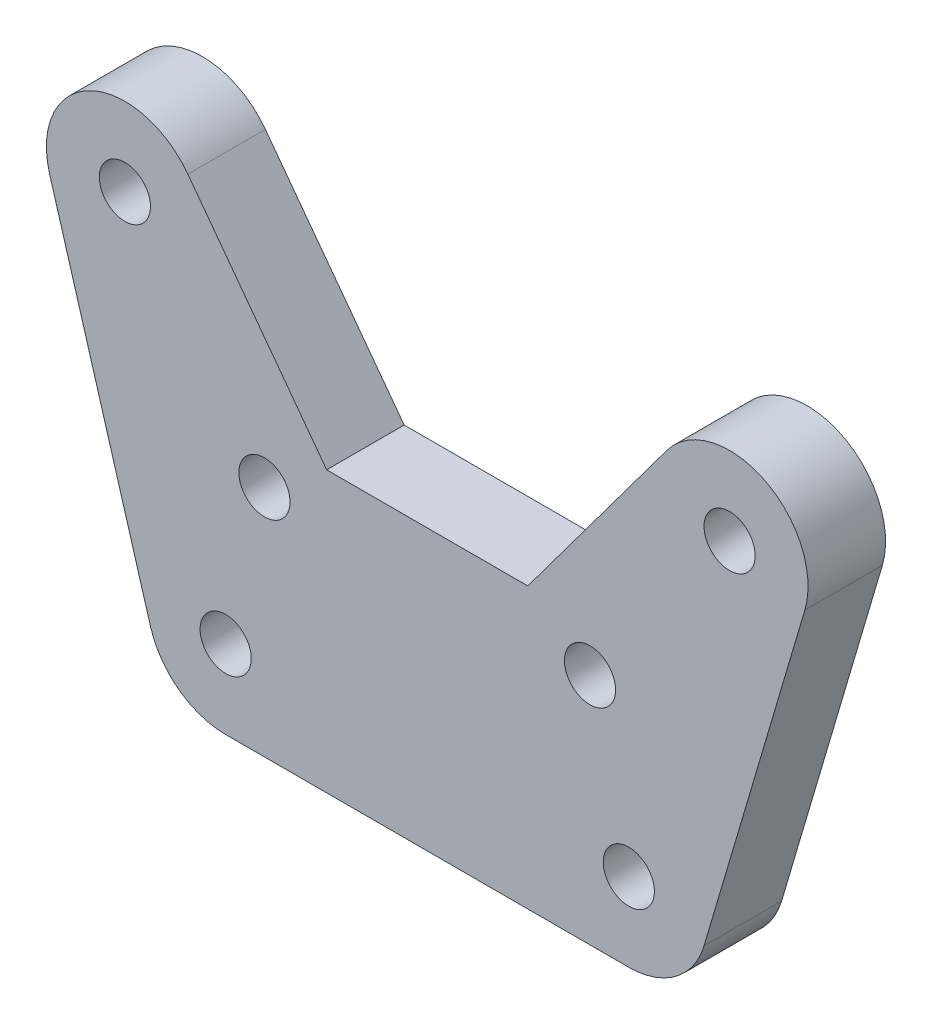
ISO-10303-21;
HEADER;
FILE_DESCRIPTION(('STEP AP214'),'2;1');
FILE_NAME('part.step','',(''),(''),'','','');
FILE_SCHEMA(('AUTOMOTIVE_DESIGN { 1 0 10303 214 1 1 1 1 }'));
ENDSEC;
DATA;
#1=APPLICATION_CONTEXT('core data for automotive mechanical design processes');
#2=APPLICATION_PROTOCOL_DEFINITION('international standard','automotive_design',2000,#1);
#3=PRODUCT_CONTEXT('',#1,'mechanical');
#4=PRODUCT('Part','Part','',(#3));
#5=PRODUCT_RELATED_PRODUCT_CATEGORY('part','',(#4));
#6=PRODUCT_DEFINITION_FORMATION('','',#4);
#7=PRODUCT_DEFINITION_CONTEXT('part definition',#1,'design');
#8=PRODUCT_DEFINITION('design','',#6,#7);
#9=PRODUCT_DEFINITION_SHAPE('','',#8);
#10=(LENGTH_UNIT() NAMED_UNIT(*) SI_UNIT(.MILLI.,.METRE.));
#11=(NAMED_UNIT(*) PLANE_ANGLE_UNIT() SI_UNIT($,.RADIAN.));
#12=(NAMED_UNIT(*) SI_UNIT($,.STERADIAN.) SOLID_ANGLE_UNIT());
#13=UNCERTAINTY_MEASURE_WITH_UNIT(LENGTH_MEASURE(1.E-05),#10,'distance_accuracy_value','');
#14=(GEOMETRIC_REPRESENTATION_CONTEXT(3) GLOBAL_UNCERTAINTY_ASSIGNED_CONTEXT((#13)) GLOBAL_UNIT_ASSIGNED_CONTEXT((#10,
#11,#12)) REPRESENTATION_CONTEXT('',''));
#15=CARTESIAN_POINT('',(0.,0.,0.));
#16=DIRECTION('',(0.,0.,1.));
#17=DIRECTION('',(1.,0.,0.));
#18=AXIS2_PLACEMENT_3D('',#15,#16,#17);
#19=CARTESIAN_POINT('',(13.,-10.,5.));
#20=DIRECTION('',(0.,0.,1.));
#21=DIRECTION('',(1.,0.,0.));
#22=AXIS2_PLACEMENT_3D('',#19,#20,#21);
#23=PLANE('',#22);
#24=CARTESIAN_POINT('',(-19.5,12.,5.));
#25=DIRECTION('',(0.,0.,1.));
#26=DIRECTION('',(-1.,0.,0.));
#27=AXIS2_PLACEMENT_3D('',#24,#25,#26);
#28=CIRCLE('',#27,1.65);
#29=CARTESIAN_POINT('',(-21.15,12.,5.));
#30=VERTEX_POINT('',#29);
#31=EDGE_CURVE('E240',#30,#30,#28,.T.);
#32=ORIENTED_EDGE('',*,*,#31,.F.);
#33=EDGE_LOOP('',(#32));
#34=FACE_BOUND('',#33,.T.);
#35=CARTESIAN_POINT('',(13.,-10.,5.));
#36=DIRECTION('',(0.,0.,1.));
#37=DIRECTION('',(1.,0.,0.));
#38=AXIS2_PLACEMENT_3D('',#35,#36,#37);
#39=CIRCLE('',#38,1.65);
#40=CARTESIAN_POINT('',(14.65,-10.,5.));
#41=VERTEX_POINT('',#40);
#42=EDGE_CURVE('E228',#41,#41,#39,.T.);
#43=ORIENTED_EDGE('',*,*,#42,.F.);
#44=EDGE_LOOP('',(#43));
#45=FACE_BOUND('',#44,.T.);
#46=CARTESIAN_POINT('',(10.5,0.,5.));
#47=DIRECTION('',(0.,0.,1.));
#48=DIRECTION('',(1.,0.,0.));
#49=AXIS2_PLACEMENT_3D('',#46,#47,#48);
#50=CIRCLE('',#49,1.65);
#51=CARTESIAN_POINT('',(12.15,0.,5.));
#52=VERTEX_POINT('',#51);
#53=EDGE_CURVE('E156',#52,#52,#50,.T.);
#54=ORIENTED_EDGE('',*,*,#53,.F.);
#55=EDGE_LOOP('',(#54));
#56=FACE_BOUND('',#55,.T.);
#57=CARTESIAN_POINT('',(13.,-10.,5.));
#58=DIRECTION('',(0.,0.,1.));
#59=DIRECTION('',(1.,0.,0.));
#60=AXIS2_PLACEMENT_3D('',#57,#58,#59);
#61=CIRCLE('',#60,5.06113986733945);
#62=CARTESIAN_POINT('',(13.,-15.0611398673394,5.));
#63=VERTEX_POINT('',#62);
#64=CARTESIAN_POINT('',(17.8537227557414,-11.43405445056,5.));
#65=VERTEX_POINT('',#64);
#66=EDGE_CURVE('E171',#63,#65,#61,.T.);
#67=ORIENTED_EDGE('',*,*,#66,.T.);
#68=DIRECTION('',(0.283346141017402,0.9590177080589,0.));
#69=VECTOR('',#68,1.);
#70=CARTESIAN_POINT('',(17.8537227557414,-11.43405445056,5.));
#71=LINE('',#70,#69);
#72=CARTESIAN_POINT('',(24.3537227557414,10.56594554944,5.));
#73=VERTEX_POINT('',#72);
#74=EDGE_CURVE('E109',#65,#73,#71,.T.);
#75=ORIENTED_EDGE('',*,*,#74,.T.);
#76=CARTESIAN_POINT('',(19.5,12.,5.));
#77=DIRECTION('',(0.,0.,1.));
#78=DIRECTION('',(1.,0.,0.));
#79=AXIS2_PLACEMENT_3D('',#76,#77,#78);
#80=CIRCLE('',#79,5.06113986733945);
#81=CARTESIAN_POINT('',(15.4387442431768,15.0201553659445,5.));
#82=VERTEX_POINT('',#81);
#83=EDGE_CURVE('E192',#73,#82,#80,.T.);
#84=ORIENTED_EDGE('',*,*,#83,.T.);
#85=DIRECTION('',(-0.596734222943357,-0.802438949184415,0.));
#86=VECTOR('',#85,1.);
#87=CARTESIAN_POINT('',(15.4387442431768,15.0201553659445,5.));
#88=LINE('',#87,#86);
#89=CARTESIAN_POINT('',(6.48780525407793,2.98367111471678,5.));
#90=VERTEX_POINT('',#89);
#91=EDGE_CURVE('E211',#82,#90,#88,.T.);
#92=ORIENTED_EDGE('',*,*,#91,.T.);
#93=DIRECTION('',(-1.,0.,0.));
#94=VECTOR('',#93,1.);
#95=CARTESIAN_POINT('',(6.48780525407793,2.98367111471678,5.));
#96=LINE('',#95,#94);
#97=CARTESIAN_POINT('',(-6.48780525407793,2.98367111471678,5.));
#98=VERTEX_POINT('',#97);
#99=EDGE_CURVE('E208',#90,#98,#96,.T.);
#100=ORIENTED_EDGE('',*,*,#99,.T.);
#101=DIRECTION('',(-0.596734222943357,0.802438949184415,0.));
#102=VECTOR('',#101,1.);
#103=CARTESIAN_POINT('',(-15.4387442431768,15.0201553659445,5.));
#104=LINE('',#103,#102);
#105=CARTESIAN_POINT('',(-15.4387442431768,15.0201553659445,5.));
#106=VERTEX_POINT('',#105);
#107=EDGE_CURVE('E210',#98,#106,#104,.T.);
#108=ORIENTED_EDGE('',*,*,#107,.T.);
#109=CARTESIAN_POINT('',(-19.5,12.,5.));
#110=DIRECTION('',(0.,0.,1.));
#111=DIRECTION('',(-1.,0.,0.));
#112=AXIS2_PLACEMENT_3D('',#109,#110,#111);
#113=CIRCLE('',#112,5.06113986733945);
#114=CARTESIAN_POINT('',(-24.3537227557414,10.56594554944,5.));
#115=VERTEX_POINT('',#114);
#116=EDGE_CURVE('E134',#106,#115,#113,.T.);
#117=ORIENTED_EDGE('',*,*,#116,.T.);
#118=DIRECTION('',(0.283346141017402,-0.9590177080589,0.));
#119=VECTOR('',#118,1.);
#120=CARTESIAN_POINT('',(-17.8537227557414,-11.43405445056,5.));
#121=LINE('',#120,#119);
#122=CARTESIAN_POINT('',(-17.8537227557414,-11.43405445056,5.));
#123=VERTEX_POINT('',#122);
#124=EDGE_CURVE('E128',#115,#123,#121,.T.);
#125=ORIENTED_EDGE('',*,*,#124,.T.);
#126=CARTESIAN_POINT('',(-13.,-10.,5.));
#127=DIRECTION('',(0.,0.,1.));
#128=DIRECTION('',(-1.,0.,0.));
#129=AXIS2_PLACEMENT_3D('',#126,#127,#128);
#130=CIRCLE('',#129,5.06113986733945);
#131=CARTESIAN_POINT('',(-13.,-15.0611398673394,5.));
#132=VERTEX_POINT('',#131);
#133=EDGE_CURVE('E132',#123,#132,#130,.T.);
#134=ORIENTED_EDGE('',*,*,#133,.T.);
#135=DIRECTION('',(1.,0.,0.));
#136=VECTOR('',#135,1.);
#137=CARTESIAN_POINT('',(13.,-15.0611398673394,5.));
#138=LINE('',#137,#136);
#139=EDGE_CURVE('E60',#132,#63,#138,.T.);
#140=ORIENTED_EDGE('',*,*,#139,.T.);
#141=EDGE_LOOP('',(#67,#75,#84,#92,#100,#108,#117,#125,#134,#140));
#142=FACE_BOUND('',#141,.T.);
#143=CARTESIAN_POINT('',(19.5,12.,5.));
#144=DIRECTION('',(0.,0.,1.));
#145=DIRECTION('',(1.,0.,0.));
#146=AXIS2_PLACEMENT_3D('',#143,#144,#145);
#147=CIRCLE('',#146,1.65);
#148=CARTESIAN_POINT('',(21.15,12.,5.));
#149=VERTEX_POINT('',#148);
#150=EDGE_CURVE('E222',#149,#149,#147,.T.);
#151=ORIENTED_EDGE('',*,*,#150,.F.);
#152=EDGE_LOOP('',(#151));
#153=FACE_BOUND('',#152,.T.);
#154=CARTESIAN_POINT('',(-13.,-10.,5.));
#155=DIRECTION('',(0.,0.,1.));
#156=DIRECTION('',(-1.,0.,0.));
#157=AXIS2_PLACEMENT_3D('',#154,#155,#156);
#158=CIRCLE('',#157,1.65);
#159=CARTESIAN_POINT('',(-14.65,-10.,5.));
#160=VERTEX_POINT('',#159);
#161=EDGE_CURVE('E234',#160,#160,#158,.T.);
#162=ORIENTED_EDGE('',*,*,#161,.F.);
#163=EDGE_LOOP('',(#162));
#164=FACE_BOUND('',#163,.T.);
#165=CARTESIAN_POINT('',(-10.5,0.,5.));
#166=DIRECTION('',(0.,0.,1.));
#167=DIRECTION('',(-1.,0.,0.));
#168=AXIS2_PLACEMENT_3D('',#165,#166,#167);
#169=CIRCLE('',#168,1.65);
#170=CARTESIAN_POINT('',(-12.15,0.,5.));
#171=VERTEX_POINT('',#170);
#172=EDGE_CURVE('E246',#171,#171,#169,.T.);
#173=ORIENTED_EDGE('',*,*,#172,.F.);
#174=EDGE_LOOP('',(#173));
#175=FACE_BOUND('',#174,.T.);
#176=ADVANCED_FACE('F43',(#34,#45,#56,#142,#153,#164,#175),#23,.T.);
#177=CARTESIAN_POINT('',(13.,-10.,0.));
#178=DIRECTION('',(0.,0.,1.));
#179=DIRECTION('',(1.,0.,0.));
#180=AXIS2_PLACEMENT_3D('',#177,#178,#179);
#181=PLANE('',#180);
#182=CARTESIAN_POINT('',(13.,-10.,0.));
#183=DIRECTION('',(0.,0.,1.));
#184=DIRECTION('',(1.,0.,0.));
#185=AXIS2_PLACEMENT_3D('',#182,#183,#184);
#186=CIRCLE('',#185,5.06113986733945);
#187=CARTESIAN_POINT('',(13.,-15.0611398673394,0.));
#188=VERTEX_POINT('',#187);
#189=CARTESIAN_POINT('',(17.8537227557414,-11.43405445056,0.));
#190=VERTEX_POINT('',#189);
#191=EDGE_CURVE('E152',#188,#190,#186,.T.);
#192=ORIENTED_EDGE('',*,*,#191,.F.);
#193=DIRECTION('',(1.,0.,0.));
#194=VECTOR('',#193,1.);
#195=CARTESIAN_POINT('',(13.,-15.0611398673394,0.));
#196=LINE('',#195,#194);
#197=CARTESIAN_POINT('',(-13.,-15.0611398673394,0.));
#198=VERTEX_POINT('',#197);
#199=EDGE_CURVE('E101',#198,#188,#196,.T.);
#200=ORIENTED_EDGE('',*,*,#199,.F.);
#201=CARTESIAN_POINT('',(-13.,-10.,0.));
#202=DIRECTION('',(0.,0.,1.));
#203=DIRECTION('',(-1.,0.,0.));
#204=AXIS2_PLACEMENT_3D('',#201,#202,#203);
#205=CIRCLE('',#204,5.06113986733945);
#206=CARTESIAN_POINT('',(-17.8537227557414,-11.43405445056,0.));
#207=VERTEX_POINT('',#206);
#208=EDGE_CURVE('E95',#207,#198,#205,.T.);
#209=ORIENTED_EDGE('',*,*,#208,.F.);
#210=DIRECTION('',(0.283346141017402,-0.9590177080589,0.));
#211=VECTOR('',#210,1.);
#212=CARTESIAN_POINT('',(-17.8537227557414,-11.43405445056,0.));
#213=LINE('',#212,#211);
#214=CARTESIAN_POINT('',(-24.3537227557414,10.56594554944,0.));
#215=VERTEX_POINT('',#214);
#216=EDGE_CURVE('E142',#215,#207,#213,.T.);
#217=ORIENTED_EDGE('',*,*,#216,.F.);
#218=CARTESIAN_POINT('',(-19.5,12.,0.));
#219=DIRECTION('',(0.,0.,1.));
#220=DIRECTION('',(-1.,0.,0.));
#221=AXIS2_PLACEMENT_3D('',#218,#219,#220);
#222=CIRCLE('',#221,5.06113986733945);
#223=CARTESIAN_POINT('',(-15.4387442431768,15.0201553659445,0.));
#224=VERTEX_POINT('',#223);
#225=EDGE_CURVE('E166',#224,#215,#222,.T.);
#226=ORIENTED_EDGE('',*,*,#225,.F.);
#227=DIRECTION('',(-0.596734222943357,0.802438949184415,0.));
#228=VECTOR('',#227,1.);
#229=CARTESIAN_POINT('',(-15.4387442431768,15.0201553659445,0.));
#230=LINE('',#229,#228);
#231=CARTESIAN_POINT('',(-6.48780525407793,2.98367111471678,0.));
#232=VERTEX_POINT('',#231);
#233=EDGE_CURVE('E164',#232,#224,#230,.T.);
#234=ORIENTED_EDGE('',*,*,#233,.F.);
#235=DIRECTION('',(-1.,0.,0.));
#236=VECTOR('',#235,1.);
#237=CARTESIAN_POINT('',(6.48780525407793,2.98367111471678,0.));
#238=LINE('',#237,#236);
#239=CARTESIAN_POINT('',(6.48780525407793,2.98367111471678,0.));
#240=VERTEX_POINT('',#239);
#241=EDGE_CURVE('E162',#240,#232,#238,.T.);
#242=ORIENTED_EDGE('',*,*,#241,.F.);
#243=DIRECTION('',(-0.596734222943357,-0.802438949184415,0.));
#244=VECTOR('',#243,1.);
#245=CARTESIAN_POINT('',(15.4387442431768,15.0201553659445,0.));
#246=LINE('',#245,#244);
#247=CARTESIAN_POINT('',(15.4387442431768,15.0201553659445,0.));
#248=VERTEX_POINT('',#247);
#249=EDGE_CURVE('E160',#248,#240,#246,.T.);
#250=ORIENTED_EDGE('',*,*,#249,.F.);
#251=CARTESIAN_POINT('',(19.5,12.,0.));
#252=DIRECTION('',(0.,0.,1.));
#253=DIRECTION('',(1.,0.,0.));
#254=AXIS2_PLACEMENT_3D('',#251,#252,#253);
#255=CIRCLE('',#254,5.06113986733945);
#256=CARTESIAN_POINT('',(24.3537227557414,10.56594554944,0.));
#257=VERTEX_POINT('',#256);
#258=EDGE_CURVE('E158',#257,#248,#255,.T.);
#259=ORIENTED_EDGE('',*,*,#258,.F.);
#260=DIRECTION('',(0.283346141017402,0.9590177080589,0.));
#261=VECTOR('',#260,1.);
#262=CARTESIAN_POINT('',(17.8537227557414,-11.43405445056,0.));
#263=LINE('',#262,#261);
#264=EDGE_CURVE('E155',#190,#257,#263,.T.);
#265=ORIENTED_EDGE('',*,*,#264,.F.);
#266=EDGE_LOOP('',(#192,#200,#209,#217,#226,#234,#242,#250,#259,#265));
#267=FACE_BOUND('',#266,.T.);
#268=CARTESIAN_POINT('',(10.5,0.,0.));
#269=DIRECTION('',(0.,0.,1.));
#270=DIRECTION('',(1.,0.,0.));
#271=AXIS2_PLACEMENT_3D('',#268,#269,#270);
#272=CIRCLE('',#271,1.65);
#273=CARTESIAN_POINT('',(12.15,0.,0.));
#274=VERTEX_POINT('',#273);
#275=EDGE_CURVE('E219',#274,#274,#272,.T.);
#276=ORIENTED_EDGE('',*,*,#275,.T.);
#277=EDGE_LOOP('',(#276));
#278=FACE_BOUND('',#277,.T.);
#279=CARTESIAN_POINT('',(19.5,12.,0.));
#280=DIRECTION('',(0.,0.,1.));
#281=DIRECTION('',(1.,0.,0.));
#282=AXIS2_PLACEMENT_3D('',#279,#280,#281);
#283=CIRCLE('',#282,1.65);
#284=CARTESIAN_POINT('',(21.15,12.,0.));
#285=VERTEX_POINT('',#284);
#286=EDGE_CURVE('E225',#285,#285,#283,.T.);
#287=ORIENTED_EDGE('',*,*,#286,.T.);
#288=EDGE_LOOP('',(#287));
#289=FACE_BOUND('',#288,.T.);
#290=CARTESIAN_POINT('',(13.,-10.,0.));
#291=DIRECTION('',(0.,0.,1.));
#292=DIRECTION('',(1.,0.,0.));
#293=AXIS2_PLACEMENT_3D('',#290,#291,#292);
#294=CIRCLE('',#293,1.65);
#295=CARTESIAN_POINT('',(14.65,-10.,0.));
#296=VERTEX_POINT('',#295);
#297=EDGE_CURVE('E231',#296,#296,#294,.T.);
#298=ORIENTED_EDGE('',*,*,#297,.T.);
#299=EDGE_LOOP('',(#298));
#300=FACE_BOUND('',#299,.T.);
#301=CARTESIAN_POINT('',(-13.,-10.,0.));
#302=DIRECTION('',(0.,0.,1.));
#303=DIRECTION('',(-1.,0.,0.));
#304=AXIS2_PLACEMENT_3D('',#301,#302,#303);
#305=CIRCLE('',#304,1.65);
#306=CARTESIAN_POINT('',(-14.65,-10.,0.));
#307=VERTEX_POINT('',#306);
#308=EDGE_CURVE('E237',#307,#307,#305,.T.);
#309=ORIENTED_EDGE('',*,*,#308,.T.);
#310=EDGE_LOOP('',(#309));
#311=FACE_BOUND('',#310,.T.);
#312=CARTESIAN_POINT('',(-19.5,12.,0.));
#313=DIRECTION('',(0.,0.,1.));
#314=DIRECTION('',(-1.,0.,0.));
#315=AXIS2_PLACEMENT_3D('',#312,#313,#314);
#316=CIRCLE('',#315,1.65);
#317=CARTESIAN_POINT('',(-21.15,12.,0.));
#318=VERTEX_POINT('',#317);
#319=EDGE_CURVE('E243',#318,#318,#316,.T.);
#320=ORIENTED_EDGE('',*,*,#319,.T.);
#321=EDGE_LOOP('',(#320));
#322=FACE_BOUND('',#321,.T.);
#323=CARTESIAN_POINT('',(-10.5,0.,0.));
#324=DIRECTION('',(0.,0.,1.));
#325=DIRECTION('',(-1.,0.,0.));
#326=AXIS2_PLACEMENT_3D('',#323,#324,#325);
#327=CIRCLE('',#326,1.65);
#328=CARTESIAN_POINT('',(-12.15,0.,0.));
#329=VERTEX_POINT('',#328);
#330=EDGE_CURVE('E249',#329,#329,#327,.T.);
#331=ORIENTED_EDGE('',*,*,#330,.T.);
#332=EDGE_LOOP('',(#331));
#333=FACE_BOUND('',#332,.T.);
#334=ADVANCED_FACE('F196',(#267,#278,#289,#300,#311,#322,#333),#181,.F.);
#335=CARTESIAN_POINT('',(13.,-10.,5.));
#336=DIRECTION('',(0.,0.,-1.));
#337=DIRECTION('',(-1.,0.,0.));
#338=AXIS2_PLACEMENT_3D('',#335,#336,#337);
#339=CYLINDRICAL_SURFACE('',#338,5.06113986733945);
#340=ORIENTED_EDGE('',*,*,#191,.T.);
#341=DIRECTION('',(0.,0.,-1.));
#342=VECTOR('',#341,1.);
#343=CARTESIAN_POINT('',(17.8537227557414,-11.43405445056,5.));
#344=LINE('',#343,#342);
#345=EDGE_CURVE('E13',#65,#190,#344,.T.);
#346=ORIENTED_EDGE('',*,*,#345,.F.);
#347=ORIENTED_EDGE('',*,*,#66,.F.);
#348=DIRECTION('',(0.,0.,-1.));
#349=VECTOR('',#348,1.);
#350=CARTESIAN_POINT('',(13.,-15.0611398673394,5.));
#351=LINE('',#350,#349);
#352=EDGE_CURVE('E148',#63,#188,#351,.T.);
#353=ORIENTED_EDGE('',*,*,#352,.T.);
#354=EDGE_LOOP('',(#340,#346,#347,#353));
#355=FACE_BOUND('',#354,.T.);
#356=ADVANCED_FACE('F45',(#355),#339,.T.);
#357=CARTESIAN_POINT('',(17.8537227557414,-11.43405445056,5.));
#358=DIRECTION('',(-0.9590177080589,0.283346141017403,0.));
#359=DIRECTION('',(-0.283346141017403,-0.9590177080589,0.));
#360=AXIS2_PLACEMENT_3D('',#357,#358,#359);
#361=PLANE('',#360);
#362=ORIENTED_EDGE('',*,*,#264,.T.);
#363=DIRECTION('',(0.,0.,-1.));
#364=VECTOR('',#363,1.);
#365=CARTESIAN_POINT('',(24.3537227557414,10.56594554944,5.));
#366=LINE('',#365,#364);
#367=EDGE_CURVE('E52',#73,#257,#366,.T.);
#368=ORIENTED_EDGE('',*,*,#367,.F.);
#369=ORIENTED_EDGE('',*,*,#74,.F.);
#370=ORIENTED_EDGE('',*,*,#345,.T.);
#371=EDGE_LOOP('',(#362,#368,#369,#370));
#372=FACE_BOUND('',#371,.T.);
#373=ADVANCED_FACE('F291',(#372),#361,.F.);
#374=CARTESIAN_POINT('',(19.5,12.,5.));
#375=DIRECTION('',(0.,0.,-1.));
#376=DIRECTION('',(-1.,0.,0.));
#377=AXIS2_PLACEMENT_3D('',#374,#375,#376);
#378=CYLINDRICAL_SURFACE('',#377,5.06113986733945);
#379=ORIENTED_EDGE('',*,*,#258,.T.);
#380=DIRECTION('',(0.,0.,-1.));
#381=VECTOR('',#380,1.);
#382=CARTESIAN_POINT('',(15.4387442431768,15.0201553659445,5.));
#383=LINE('',#382,#381);
#384=EDGE_CURVE('E184',#82,#248,#383,.T.);
#385=ORIENTED_EDGE('',*,*,#384,.F.);
#386=ORIENTED_EDGE('',*,*,#83,.F.);
#387=ORIENTED_EDGE('',*,*,#367,.T.);
#388=EDGE_LOOP('',(#379,#385,#386,#387));
#389=FACE_BOUND('',#388,.T.);
#390=ADVANCED_FACE('F190',(#389),#378,.T.);
#391=CARTESIAN_POINT('',(15.4387442431768,15.0201553659445,5.));
#392=DIRECTION('',(0.802438949184415,-0.596734222943357,0.));
#393=DIRECTION('',(0.596734222943357,0.802438949184415,0.));
#394=AXIS2_PLACEMENT_3D('',#391,#392,#393);
#395=PLANE('',#394);
#396=ORIENTED_EDGE('',*,*,#249,.T.);
#397=DIRECTION('',(0.,0.,-1.));
#398=VECTOR('',#397,1.);
#399=CARTESIAN_POINT('',(6.48780525407793,2.98367111471678,5.));
#400=LINE('',#399,#398);
#401=EDGE_CURVE('E181',#90,#240,#400,.T.);
#402=ORIENTED_EDGE('',*,*,#401,.F.);
#403=ORIENTED_EDGE('',*,*,#91,.F.);
#404=ORIENTED_EDGE('',*,*,#384,.T.);
#405=EDGE_LOOP('',(#396,#402,#403,#404));
#406=FACE_BOUND('',#405,.T.);
#407=ADVANCED_FACE('F202',(#406),#395,.F.);
#408=CARTESIAN_POINT('',(6.48780525407793,2.98367111471678,5.));
#409=DIRECTION('',(0.,-1.,0.));
#410=DIRECTION('',(0.,0.,-1.));
#411=AXIS2_PLACEMENT_3D('',#408,#409,#410);
#412=PLANE('',#411);
#413=ORIENTED_EDGE('',*,*,#241,.T.);
#414=DIRECTION('',(0.,0.,-1.));
#415=VECTOR('',#414,1.);
#416=CARTESIAN_POINT('',(-6.48780525407793,2.98367111471678,5.));
#417=LINE('',#416,#415);
#418=EDGE_CURVE('E178',#98,#232,#417,.T.);
#419=ORIENTED_EDGE('',*,*,#418,.F.);
#420=ORIENTED_EDGE('',*,*,#99,.F.);
#421=ORIENTED_EDGE('',*,*,#401,.T.);
#422=EDGE_LOOP('',(#413,#419,#420,#421));
#423=FACE_BOUND('',#422,.T.);
#424=ADVANCED_FACE('F206',(#423),#412,.F.);
#425=CARTESIAN_POINT('',(-15.4387442431768,15.0201553659445,5.));
#426=DIRECTION('',(-0.802438949184415,-0.596734222943357,0.));
#427=DIRECTION('',(0.596734222943357,-0.802438949184415,0.));
#428=AXIS2_PLACEMENT_3D('',#425,#426,#427);
#429=PLANE('',#428);
#430=ORIENTED_EDGE('',*,*,#233,.T.);
#431=DIRECTION('',(0.,0.,-1.));
#432=VECTOR('',#431,1.);
#433=CARTESIAN_POINT('',(-15.4387442431768,15.0201553659445,5.));
#434=LINE('',#433,#432);
#435=EDGE_CURVE('E175',#106,#224,#434,.T.);
#436=ORIENTED_EDGE('',*,*,#435,.F.);
#437=ORIENTED_EDGE('',*,*,#107,.F.);
#438=ORIENTED_EDGE('',*,*,#418,.T.);
#439=EDGE_LOOP('',(#430,#436,#437,#438));
#440=FACE_BOUND('',#439,.T.);
#441=ADVANCED_FACE('F281',(#440),#429,.F.);
#442=CARTESIAN_POINT('',(-19.5,12.,5.));
#443=DIRECTION('',(0.,0.,-1.));
#444=DIRECTION('',(-1.,0.,0.));
#445=AXIS2_PLACEMENT_3D('',#442,#443,#444);
#446=CYLINDRICAL_SURFACE('',#445,5.06113986733945);
#447=ORIENTED_EDGE('',*,*,#225,.T.);
#448=DIRECTION('',(0.,0.,-1.));
#449=VECTOR('',#448,1.);
#450=CARTESIAN_POINT('',(-24.3537227557414,10.56594554944,5.));
#451=LINE('',#450,#449);
#452=EDGE_CURVE('E143',#115,#215,#451,.T.);
#453=ORIENTED_EDGE('',*,*,#452,.F.);
#454=ORIENTED_EDGE('',*,*,#116,.F.);
#455=ORIENTED_EDGE('',*,*,#435,.T.);
#456=EDGE_LOOP('',(#447,#453,#454,#455));
#457=FACE_BOUND('',#456,.T.);
#458=ADVANCED_FACE('F278',(#457),#446,.T.);
#459=CARTESIAN_POINT('',(-17.8537227557414,-11.43405445056,5.));
#460=DIRECTION('',(0.9590177080589,0.283346141017403,0.));
#461=DIRECTION('',(-0.283346141017403,0.9590177080589,0.));
#462=AXIS2_PLACEMENT_3D('',#459,#460,#461);
#463=PLANE('',#462);
#464=ORIENTED_EDGE('',*,*,#216,.T.);
#465=DIRECTION('',(0.,0.,-1.));
#466=VECTOR('',#465,1.);
#467=CARTESIAN_POINT('',(-17.8537227557414,-11.43405445056,5.));
#468=LINE('',#467,#466);
#469=EDGE_CURVE('E139',#123,#207,#468,.T.);
#470=ORIENTED_EDGE('',*,*,#469,.F.);
#471=ORIENTED_EDGE('',*,*,#124,.F.);
#472=ORIENTED_EDGE('',*,*,#452,.T.);
#473=EDGE_LOOP('',(#464,#470,#471,#472));
#474=FACE_BOUND('',#473,.T.);
#475=ADVANCED_FACE('F140',(#474),#463,.F.);
#476=CARTESIAN_POINT('',(-13.,-10.,5.));
#477=DIRECTION('',(0.,0.,-1.));
#478=DIRECTION('',(-1.,0.,0.));
#479=AXIS2_PLACEMENT_3D('',#476,#477,#478);
#480=CYLINDRICAL_SURFACE('',#479,5.06113986733945);
#481=ORIENTED_EDGE('',*,*,#208,.T.);
#482=DIRECTION('',(0.,0.,-1.));
#483=VECTOR('',#482,1.);
#484=CARTESIAN_POINT('',(-13.,-15.0611398673394,5.));
#485=LINE('',#484,#483);
#486=EDGE_CURVE('E144',#132,#198,#485,.T.);
#487=ORIENTED_EDGE('',*,*,#486,.F.);
#488=ORIENTED_EDGE('',*,*,#133,.F.);
#489=ORIENTED_EDGE('',*,*,#469,.T.);
#490=EDGE_LOOP('',(#481,#487,#488,#489));
#491=FACE_BOUND('',#490,.T.);
#492=ADVANCED_FACE('F146',(#491),#480,.T.);
#493=CARTESIAN_POINT('',(13.,-15.0611398673394,5.));
#494=DIRECTION('',(0.,1.,0.));
#495=DIRECTION('',(0.,0.,1.));
#496=AXIS2_PLACEMENT_3D('',#493,#494,#495);
#497=PLANE('',#496);
#498=ORIENTED_EDGE('',*,*,#199,.T.);
#499=ORIENTED_EDGE('',*,*,#352,.F.);
#500=ORIENTED_EDGE('',*,*,#139,.F.);
#501=ORIENTED_EDGE('',*,*,#486,.T.);
#502=EDGE_LOOP('',(#498,#499,#500,#501));
#503=FACE_BOUND('',#502,.T.);
#504=ADVANCED_FACE('F271',(#503),#497,.F.);
#505=CARTESIAN_POINT('',(10.5,0.,5.));
#506=DIRECTION('',(0.,0.,-1.));
#507=DIRECTION('',(-1.,0.,0.));
#508=AXIS2_PLACEMENT_3D('',#505,#506,#507);
#509=CYLINDRICAL_SURFACE('',#508,1.65);
#510=ORIENTED_EDGE('',*,*,#53,.T.);
#511=EDGE_LOOP('',(#510));
#512=FACE_BOUND('',#511,.T.);
#513=ORIENTED_EDGE('',*,*,#275,.F.);
#514=EDGE_LOOP('',(#513));
#515=FACE_BOUND('',#514,.T.);
#516=ADVANCED_FACE('F268',(#512,#515),#509,.F.);
#517=CARTESIAN_POINT('',(19.5,12.,5.));
#518=DIRECTION('',(0.,0.,-1.));
#519=DIRECTION('',(-1.,0.,0.));
#520=AXIS2_PLACEMENT_3D('',#517,#518,#519);
#521=CYLINDRICAL_SURFACE('',#520,1.65);
#522=ORIENTED_EDGE('',*,*,#150,.T.);
#523=EDGE_LOOP('',(#522));
#524=FACE_BOUND('',#523,.T.);
#525=ORIENTED_EDGE('',*,*,#286,.F.);
#526=EDGE_LOOP('',(#525));
#527=FACE_BOUND('',#526,.T.);
#528=ADVANCED_FACE('F367',(#524,#527),#521,.F.);
#529=CARTESIAN_POINT('',(13.,-10.,5.));
#530=DIRECTION('',(0.,0.,-1.));
#531=DIRECTION('',(-1.,0.,0.));
#532=AXIS2_PLACEMENT_3D('',#529,#530,#531);
#533=CYLINDRICAL_SURFACE('',#532,1.65);
#534=ORIENTED_EDGE('',*,*,#42,.T.);
#535=EDGE_LOOP('',(#534));
#536=FACE_BOUND('',#535,.T.);
#537=ORIENTED_EDGE('',*,*,#297,.F.);
#538=EDGE_LOOP('',(#537));
#539=FACE_BOUND('',#538,.T.);
#540=ADVANCED_FACE('F375',(#536,#539),#533,.F.);
#541=CARTESIAN_POINT('',(-13.,-10.,5.));
#542=DIRECTION('',(0.,0.,-1.));
#543=DIRECTION('',(-1.,0.,0.));
#544=AXIS2_PLACEMENT_3D('',#541,#542,#543);
#545=CYLINDRICAL_SURFACE('',#544,1.65);
#546=ORIENTED_EDGE('',*,*,#161,.T.);
#547=EDGE_LOOP('',(#546));
#548=FACE_BOUND('',#547,.T.);
#549=ORIENTED_EDGE('',*,*,#308,.F.);
#550=EDGE_LOOP('',(#549));
#551=FACE_BOUND('',#550,.T.);
#552=ADVANCED_FACE('F383',(#548,#551),#545,.F.);
#553=CARTESIAN_POINT('',(-19.5,12.,5.));
#554=DIRECTION('',(0.,0.,-1.));
#555=DIRECTION('',(-1.,0.,0.));
#556=AXIS2_PLACEMENT_3D('',#553,#554,#555);
#557=CYLINDRICAL_SURFACE('',#556,1.65);
#558=ORIENTED_EDGE('',*,*,#31,.T.);
#559=EDGE_LOOP('',(#558));
#560=FACE_BOUND('',#559,.T.);
#561=ORIENTED_EDGE('',*,*,#319,.F.);
#562=EDGE_LOOP('',(#561));
#563=FACE_BOUND('',#562,.T.);
#564=ADVANCED_FACE('F392',(#560,#563),#557,.F.);
#565=CARTESIAN_POINT('',(-10.5,0.,5.));
#566=DIRECTION('',(0.,0.,-1.));
#567=DIRECTION('',(-1.,0.,0.));
#568=AXIS2_PLACEMENT_3D('',#565,#566,#567);
#569=CYLINDRICAL_SURFACE('',#568,1.65);
#570=ORIENTED_EDGE('',*,*,#172,.T.);
#571=EDGE_LOOP('',(#570));
#572=FACE_BOUND('',#571,.T.);
#573=ORIENTED_EDGE('',*,*,#330,.F.);
#574=EDGE_LOOP('',(#573));
#575=FACE_BOUND('',#574,.T.);
#576=ADVANCED_FACE('F255',(#572,#575),#569,.F.);
#577=CLOSED_SHELL('',(#176,#334,#356,#373,#390,#407,#424,#441,#458,#475,#492,#504,#516,#528,
#540,#552,#564,#576));
#578=MANIFOLD_SOLID_BREP('B2',#577);
#579=ADVANCED_BREP_SHAPE_REPRESENTATION('',(#18,#578),#14);
#580=SHAPE_DEFINITION_REPRESENTATION(#9,#579);
ENDSEC;
END-ISO-10303-21;
